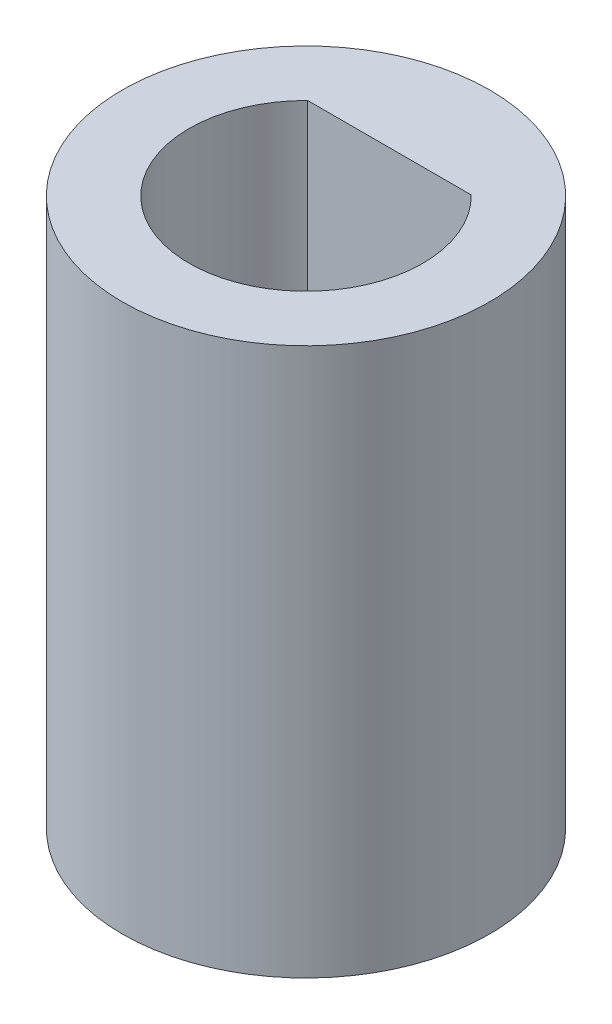
ISO-10303-21;
HEADER;
FILE_DESCRIPTION(('STEP AP214'),'2;1');
FILE_NAME('part.step','',(''),(''),'','','');
FILE_SCHEMA(('AUTOMOTIVE_DESIGN { 1 0 10303 214 1 1 1 1 }'));
ENDSEC;
DATA;
#1=APPLICATION_CONTEXT('core data for automotive mechanical design processes');
#2=APPLICATION_PROTOCOL_DEFINITION('international standard','automotive_design',2000,#1);
#3=PRODUCT_CONTEXT('',#1,'mechanical');
#4=PRODUCT('Part','Part','',(#3));
#5=PRODUCT_RELATED_PRODUCT_CATEGORY('part','',(#4));
#6=PRODUCT_DEFINITION_FORMATION('','',#4);
#7=PRODUCT_DEFINITION_CONTEXT('part definition',#1,'design');
#8=PRODUCT_DEFINITION('design','',#6,#7);
#9=PRODUCT_DEFINITION_SHAPE('','',#8);
#10=(LENGTH_UNIT() NAMED_UNIT(*) SI_UNIT(.MILLI.,.METRE.));
#11=(NAMED_UNIT(*) PLANE_ANGLE_UNIT() SI_UNIT($,.RADIAN.));
#12=(NAMED_UNIT(*) SI_UNIT($,.STERADIAN.) SOLID_ANGLE_UNIT());
#13=UNCERTAINTY_MEASURE_WITH_UNIT(LENGTH_MEASURE(1.E-05),#10,'distance_accuracy_value','');
#14=(GEOMETRIC_REPRESENTATION_CONTEXT(3) GLOBAL_UNCERTAINTY_ASSIGNED_CONTEXT((#13)) GLOBAL_UNIT_ASSIGNED_CONTEXT((#10,
#11,#12)) REPRESENTATION_CONTEXT('',''));
#15=CARTESIAN_POINT('',(0.,0.,0.));
#16=DIRECTION('',(0.,0.,1.));
#17=DIRECTION('',(1.,0.,0.));
#18=AXIS2_PLACEMENT_3D('',#15,#16,#17);
#19=CARTESIAN_POINT('',(0.,-16.4,0.));
#20=DIRECTION('',(0.,1.,0.));
#21=DIRECTION('',(0.,0.,1.));
#22=AXIS2_PLACEMENT_3D('',#19,#20,#21);
#23=CYLINDRICAL_SURFACE('',#22,5.5);
#24=CARTESIAN_POINT('',(0.,-16.4,0.));
#25=DIRECTION('',(0.,1.,0.));
#26=DIRECTION('',(0.,0.,1.));
#27=AXIS2_PLACEMENT_3D('',#24,#25,#26);
#28=CIRCLE('',#27,5.5);
#29=CARTESIAN_POINT('',(0.,-16.4,5.5));
#30=VERTEX_POINT('',#29);
#31=EDGE_CURVE('E11',#30,#30,#28,.T.);
#32=ORIENTED_EDGE('',*,*,#31,.T.);
#33=EDGE_LOOP('',(#32));
#34=FACE_BOUND('',#33,.T.);
#35=CARTESIAN_POINT('',(0.,0.,0.));
#36=DIRECTION('',(0.,1.,0.));
#37=DIRECTION('',(0.,0.,1.));
#38=AXIS2_PLACEMENT_3D('',#35,#36,#37);
#39=CIRCLE('',#38,5.5);
#40=CARTESIAN_POINT('',(0.,0.,5.5));
#41=VERTEX_POINT('',#40);
#42=EDGE_CURVE('E36',#41,#41,#39,.T.);
#43=ORIENTED_EDGE('',*,*,#42,.F.);
#44=EDGE_LOOP('',(#43));
#45=FACE_BOUND('',#44,.T.);
#46=ADVANCED_FACE('F33',(#34,#45),#23,.T.);
#47=CARTESIAN_POINT('',(0.,-16.4,0.));
#48=DIRECTION('',(0.,1.,0.));
#49=DIRECTION('',(0.,0.,1.));
#50=AXIS2_PLACEMENT_3D('',#47,#48,#49);
#51=PLANE('',#50);
#52=DIRECTION('',(-1.,0.,0.));
#53=VECTOR('',#52,1.);
#54=CARTESIAN_POINT('',(-2.44948974278318,-16.4,-2.5));
#55=LINE('',#54,#53);
#56=CARTESIAN_POINT('',(2.44948974278318,-16.4,-2.5));
#57=VERTEX_POINT('',#56);
#58=CARTESIAN_POINT('',(-2.44948974278318,-16.4,-2.5));
#59=VERTEX_POINT('',#58);
#60=EDGE_CURVE('E74',#57,#59,#55,.T.);
#61=ORIENTED_EDGE('',*,*,#60,.T.);
#62=CARTESIAN_POINT('',(0.,-16.4,0.));
#63=DIRECTION('',(0.,1.,0.));
#64=DIRECTION('',(0.,0.,1.));
#65=AXIS2_PLACEMENT_3D('',#62,#63,#64);
#66=CIRCLE('',#65,3.5);
#67=EDGE_CURVE('E47',#59,#57,#66,.T.);
#68=ORIENTED_EDGE('',*,*,#67,.T.);
#69=EDGE_LOOP('',(#61,#68));
#70=FACE_BOUND('',#69,.T.);
#71=ORIENTED_EDGE('',*,*,#31,.F.);
#72=EDGE_LOOP('',(#71));
#73=FACE_BOUND('',#72,.T.);
#74=ADVANCED_FACE('F78',(#70,#73),#51,.F.);
#75=CARTESIAN_POINT('',(0.,0.,0.));
#76=DIRECTION('',(0.,1.,0.));
#77=DIRECTION('',(0.,0.,1.));
#78=AXIS2_PLACEMENT_3D('',#75,#76,#77);
#79=PLANE('',#78);
#80=CARTESIAN_POINT('',(0.,0.,0.));
#81=DIRECTION('',(0.,1.,0.));
#82=DIRECTION('',(0.,0.,1.));
#83=AXIS2_PLACEMENT_3D('',#80,#81,#82);
#84=CIRCLE('',#83,3.5);
#85=CARTESIAN_POINT('',(-2.44948974278318,0.,-2.5));
#86=VERTEX_POINT('',#85);
#87=CARTESIAN_POINT('',(2.44948974278318,0.,-2.5));
#88=VERTEX_POINT('',#87);
#89=EDGE_CURVE('E52',#86,#88,#84,.T.);
#90=ORIENTED_EDGE('',*,*,#89,.F.);
#91=DIRECTION('',(-1.,0.,0.));
#92=VECTOR('',#91,1.);
#93=CARTESIAN_POINT('',(-2.44948974278318,0.,-2.5));
#94=LINE('',#93,#92);
#95=EDGE_CURVE('E66',#88,#86,#94,.T.);
#96=ORIENTED_EDGE('',*,*,#95,.F.);
#97=EDGE_LOOP('',(#90,#96));
#98=FACE_BOUND('',#97,.T.);
#99=ORIENTED_EDGE('',*,*,#42,.T.);
#100=EDGE_LOOP('',(#99));
#101=FACE_BOUND('',#100,.T.);
#102=ADVANCED_FACE('F70',(#98,#101),#79,.T.);
#103=CARTESIAN_POINT('',(0.,-16.4,0.));
#104=DIRECTION('',(0.,1.,0.));
#105=DIRECTION('',(0.,0.,1.));
#106=AXIS2_PLACEMENT_3D('',#103,#104,#105);
#107=CYLINDRICAL_SURFACE('',#106,3.5);
#108=ORIENTED_EDGE('',*,*,#89,.T.);
#109=DIRECTION('',(0.,1.,0.));
#110=VECTOR('',#109,1.);
#111=CARTESIAN_POINT('',(2.44948974278318,-16.4,-2.5));
#112=LINE('',#111,#110);
#113=EDGE_CURVE('E63',#57,#88,#112,.T.);
#114=ORIENTED_EDGE('',*,*,#113,.F.);
#115=ORIENTED_EDGE('',*,*,#67,.F.);
#116=DIRECTION('',(0.,1.,0.));
#117=VECTOR('',#116,1.);
#118=CARTESIAN_POINT('',(-2.44948974278318,-16.4,-2.5));
#119=LINE('',#118,#117);
#120=EDGE_CURVE('E57',#59,#86,#119,.T.);
#121=ORIENTED_EDGE('',*,*,#120,.T.);
#122=EDGE_LOOP('',(#108,#114,#115,#121));
#123=FACE_BOUND('',#122,.T.);
#124=ADVANCED_FACE('F59',(#123),#107,.F.);
#125=CARTESIAN_POINT('',(-2.44948974278318,-16.4,-2.5));
#126=DIRECTION('',(0.,0.,-1.));
#127=DIRECTION('',(-1.,0.,0.));
#128=AXIS2_PLACEMENT_3D('',#125,#126,#127);
#129=PLANE('',#128);
#130=ORIENTED_EDGE('',*,*,#95,.T.);
#131=ORIENTED_EDGE('',*,*,#120,.F.);
#132=ORIENTED_EDGE('',*,*,#60,.F.);
#133=ORIENTED_EDGE('',*,*,#113,.T.);
#134=EDGE_LOOP('',(#130,#131,#132,#133));
#135=FACE_BOUND('',#134,.T.);
#136=ADVANCED_FACE('F67',(#135),#129,.F.);
#137=CLOSED_SHELL('',(#46,#74,#102,#124,#136));
#138=MANIFOLD_SOLID_BREP('B2',#137);
#139=ADVANCED_BREP_SHAPE_REPRESENTATION('',(#18,#138),#14);
#140=SHAPE_DEFINITION_REPRESENTATION(#9,#139);
ENDSEC;
END-ISO-10303-21;
